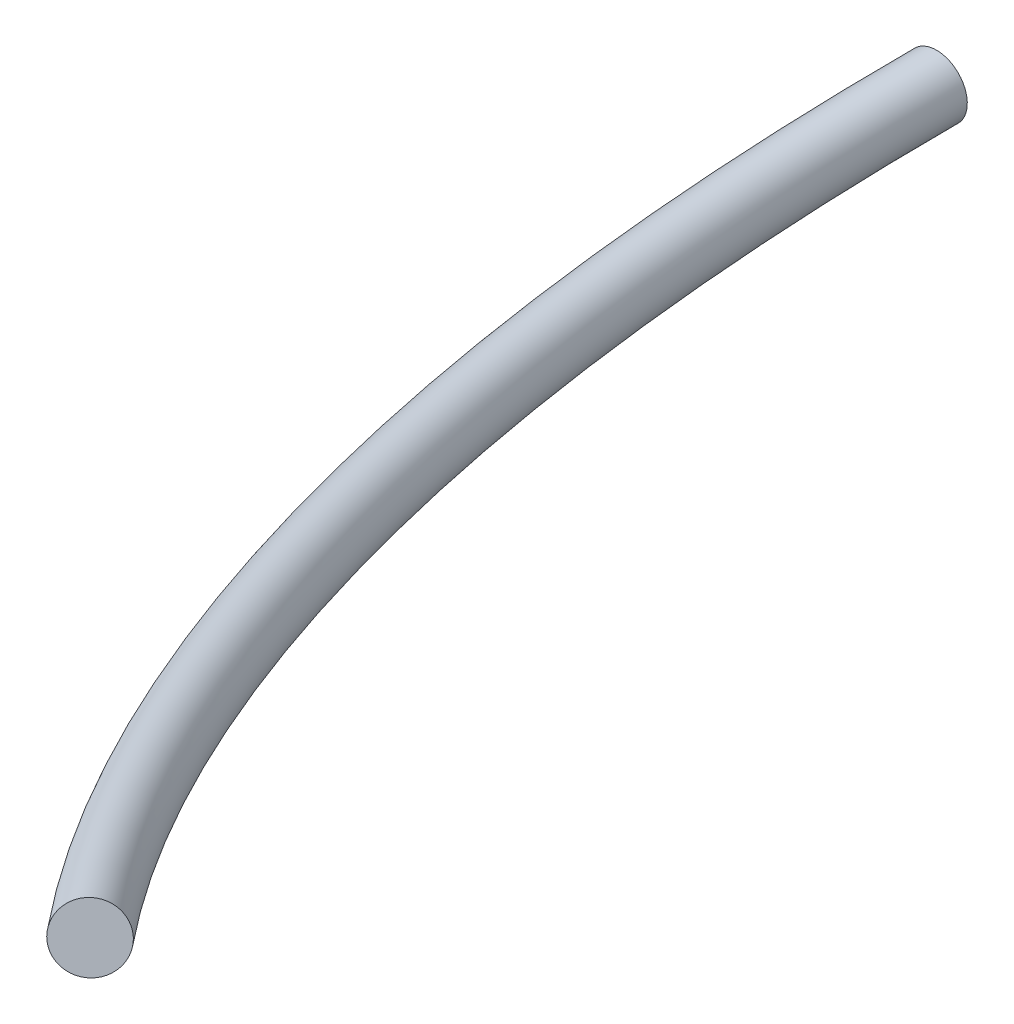
ISO-10303-21;
HEADER;
FILE_DESCRIPTION(('STEP AP214'),'2;1');
FILE_NAME('part.step','',(''),(''),'','','');
FILE_SCHEMA(('AUTOMOTIVE_DESIGN { 1 0 10303 214 1 1 1 1 }'));
ENDSEC;
DATA;
#1=APPLICATION_CONTEXT('core data for automotive mechanical design processes');
#2=APPLICATION_PROTOCOL_DEFINITION('international standard','automotive_design',2000,#1);
#3=PRODUCT_CONTEXT('',#1,'mechanical');
#4=PRODUCT('Part','Part','',(#3));
#5=PRODUCT_RELATED_PRODUCT_CATEGORY('part','',(#4));
#6=PRODUCT_DEFINITION_FORMATION('','',#4);
#7=PRODUCT_DEFINITION_CONTEXT('part definition',#1,'design');
#8=PRODUCT_DEFINITION('design','',#6,#7);
#9=PRODUCT_DEFINITION_SHAPE('','',#8);
#10=(LENGTH_UNIT() NAMED_UNIT(*) SI_UNIT(.MILLI.,.METRE.));
#11=(NAMED_UNIT(*) PLANE_ANGLE_UNIT() SI_UNIT($,.RADIAN.));
#12=(NAMED_UNIT(*) SI_UNIT($,.STERADIAN.) SOLID_ANGLE_UNIT());
#13=UNCERTAINTY_MEASURE_WITH_UNIT(LENGTH_MEASURE(1.E-05),#10,'distance_accuracy_value','');
#14=(GEOMETRIC_REPRESENTATION_CONTEXT(3) GLOBAL_UNCERTAINTY_ASSIGNED_CONTEXT((#13)) GLOBAL_UNIT_ASSIGNED_CONTEXT((#10,
#11,#12)) REPRESENTATION_CONTEXT('',''));
#15=CARTESIAN_POINT('',(0.,0.,0.));
#16=DIRECTION('',(0.,0.,1.));
#17=DIRECTION('',(1.,0.,0.));
#18=AXIS2_PLACEMENT_3D('',#15,#16,#17);
#19=CARTESIAN_POINT('',(-4405.99002979744,-12663.9080538727,-1.02140518265514E-11));
#20=DIRECTION('',(0.340690059225233,-0.94017566632258,0.));
#21=DIRECTION('',(0.94017566632258,0.340690059225233,0.));
#22=AXIS2_PLACEMENT_3D('',#19,#20,#21);
#23=TOROIDAL_SURFACE('',#22,3265.89741417307,50.7999999999818);
#24=CARTESIAN_POINT('',(-6659.70477363066,-13480.5833168654,2218.08414812127));
#25=DIRECTION('',(0.638534674380609,0.231384861174926,0.733985364726511));
#26=DIRECTION('',(0.764861608015557,-0.0852067497180066,-0.638534674380609));
#27=AXIS2_PLACEMENT_3D('',#24,#25,#26);
#28=CIRCLE('',#27,50.7999999999818);
#29=CARTESIAN_POINT('',(-6694.76059274177,-13493.2864419483,2252.58574459994));
#30=VERTEX_POINT('',#29);
#31=EDGE_CURVE('E10',#30,#30,#28,.T.);
#32=CARTESIAN_POINT('',(-7476.50730730879,-13776.5668373309,0.));
#33=DIRECTION('',(0.,0.,1.));
#34=DIRECTION('',(1.,0.,0.));
#35=AXIS2_PLACEMENT_3D('',#32,#33,#34);
#36=CIRCLE('',#35,50.7999999999818);
#37=CARTESIAN_POINT('',(-7524.26823115796,-13793.8738923395,1.58876341472601E-13));
#38=VERTEX_POINT('',#37);
#39=EDGE_CURVE('E41',#38,#38,#36,.T.);
#40=CARTESIAN_POINT('',(-4405.99002979744,-12663.9080538727,-1.02140518265514E-11));
#41=DIRECTION('',(0.340690059225233,-0.94017566632258,0.));
#42=DIRECTION('',(0.94017566632258,0.340690059225233,0.));
#43=AXIS2_PLACEMENT_3D('',#40,#41,#42);
#44=CIRCLE('',#43,3316.69741417305);
#45=EDGE_CURVE('',#30,#38,#44,.T.);
#46=ORIENTED_EDGE('',*,*,#31,.F.);
#47=ORIENTED_EDGE('',*,*,#39,.T.);
#48=ORIENTED_EDGE('',*,*,#45,.T.);
#49=ORIENTED_EDGE('',*,*,#45,.F.);
#50=EDGE_LOOP('',(#46,#48,#47,#49));
#51=FACE_BOUND('',#50,.T.);
#52=ADVANCED_FACE('F35',(#51),#23,.T.);
#53=CARTESIAN_POINT('',(-6659.70477363066,-13480.5833168654,2218.08414812127));
#54=DIRECTION('',(0.638534674380609,0.231384861174926,0.733985364726511));
#55=DIRECTION('',(0.764861608015557,-0.0852067497180066,-0.638534674380609));
#56=AXIS2_PLACEMENT_3D('',#53,#54,#55);
#57=PLANE('',#56);
#58=ORIENTED_EDGE('',*,*,#31,.T.);
#59=EDGE_LOOP('',(#58));
#60=FACE_BOUND('',#59,.T.);
#61=ADVANCED_FACE('F50',(#60),#57,.T.);
#62=CARTESIAN_POINT('',(-7476.50730730879,-13776.5668373309,0.));
#63=DIRECTION('',(0.,0.,1.));
#64=DIRECTION('',(1.,0.,0.));
#65=AXIS2_PLACEMENT_3D('',#62,#63,#64);
#66=PLANE('',#65);
#67=ORIENTED_EDGE('',*,*,#39,.F.);
#68=EDGE_LOOP('',(#67));
#69=FACE_BOUND('',#68,.T.);
#70=ADVANCED_FACE('F48',(#69),#66,.F.);
#71=CLOSED_SHELL('',(#52,#61,#70));
#72=MANIFOLD_SOLID_BREP('B2',#71);
#73=ADVANCED_BREP_SHAPE_REPRESENTATION('',(#18,#72),#14);
#74=SHAPE_DEFINITION_REPRESENTATION(#9,#73);
ENDSEC;
END-ISO-10303-21;
